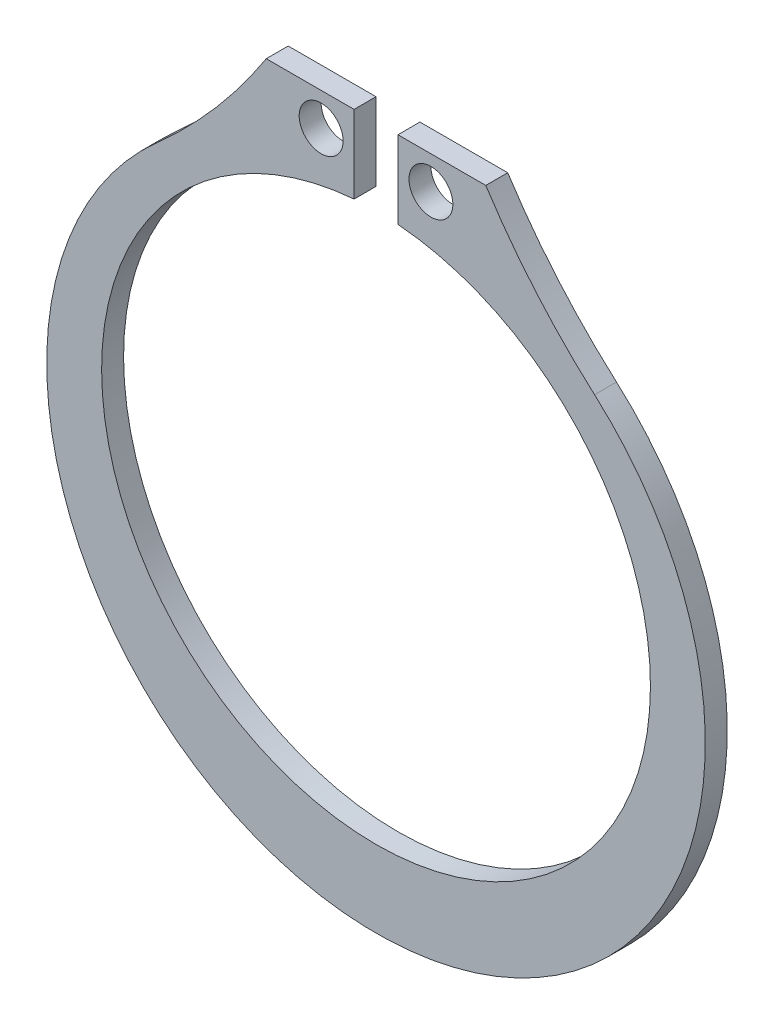
ISO-10303-21;
HEADER;
FILE_DESCRIPTION(('STEP AP214'),'2;1');
FILE_NAME('part.step','',(''),(''),'','','');
FILE_SCHEMA(('AUTOMOTIVE_DESIGN { 1 0 10303 214 1 1 1 1 }'));
ENDSEC;
DATA;
#1=APPLICATION_CONTEXT('core data for automotive mechanical design processes');
#2=APPLICATION_PROTOCOL_DEFINITION('international standard','automotive_design',2000,#1);
#3=PRODUCT_CONTEXT('',#1,'mechanical');
#4=PRODUCT('Part','Part','',(#3));
#5=PRODUCT_RELATED_PRODUCT_CATEGORY('part','',(#4));
#6=PRODUCT_DEFINITION_FORMATION('','',#4);
#7=PRODUCT_DEFINITION_CONTEXT('part definition',#1,'design');
#8=PRODUCT_DEFINITION('design','',#6,#7);
#9=PRODUCT_DEFINITION_SHAPE('','',#8);
#10=(LENGTH_UNIT() NAMED_UNIT(*) SI_UNIT(.MILLI.,.METRE.));
#11=(NAMED_UNIT(*) PLANE_ANGLE_UNIT() SI_UNIT($,.RADIAN.));
#12=(NAMED_UNIT(*) SI_UNIT($,.STERADIAN.) SOLID_ANGLE_UNIT());
#13=UNCERTAINTY_MEASURE_WITH_UNIT(LENGTH_MEASURE(1.E-05),#10,'distance_accuracy_value','');
#14=(GEOMETRIC_REPRESENTATION_CONTEXT(3) GLOBAL_UNCERTAINTY_ASSIGNED_CONTEXT((#13)) GLOBAL_UNIT_ASSIGNED_CONTEXT((#10,
#11,#12)) REPRESENTATION_CONTEXT('',''));
#15=CARTESIAN_POINT('',(0.,0.,0.));
#16=DIRECTION('',(0.,0.,1.));
#17=DIRECTION('',(1.,0.,0.));
#18=AXIS2_PLACEMENT_3D('',#15,#16,#17);
#19=CARTESIAN_POINT('',(-28.5373817339157,32.165475960613,1.));
#20=DIRECTION('',(0.,0.,-1.));
#21=DIRECTION('',(-1.,0.,0.));
#22=AXIS2_PLACEMENT_3D('',#19,#20,#21);
#23=PLANE('',#22);
#24=CARTESIAN_POINT('',(-28.5373817339157,32.165475960613,1.));
#25=DIRECTION('',(0.,0.,-1.));
#26=DIRECTION('',(-1.,0.,0.));
#27=AXIS2_PLACEMENT_3D('',#24,#25,#26);
#28=CIRCLE('',#27,28.);
#29=CARTESIAN_POINT('',(-5.,17.,1.));
#30=VERTEX_POINT('',#29);
#31=CARTESIAN_POINT('',(-9.95490060485431,11.2205148699813,1.));
#32=VERTEX_POINT('',#31);
#33=EDGE_CURVE('E146',#30,#32,#28,.T.);
#34=ORIENTED_EDGE('',*,*,#33,.T.);
#35=CARTESIAN_POINT('',(0.,0.,1.));
#36=DIRECTION('',(0.,0.,1.));
#37=DIRECTION('',(1.,0.,0.));
#38=AXIS2_PLACEMENT_3D('',#35,#36,#37);
#39=CIRCLE('',#38,15.);
#40=CARTESIAN_POINT('',(9.95490060485431,11.2205148699813,1.));
#41=VERTEX_POINT('',#40);
#42=EDGE_CURVE('E100',#32,#41,#39,.T.);
#43=ORIENTED_EDGE('',*,*,#42,.T.);
#44=CARTESIAN_POINT('',(28.5373817339157,32.165475960613,1.));
#45=DIRECTION('',(0.,0.,-1.));
#46=DIRECTION('',(1.,0.,0.));
#47=AXIS2_PLACEMENT_3D('',#44,#45,#46);
#48=CIRCLE('',#47,28.);
#49=CARTESIAN_POINT('',(5.,17.,1.));
#50=VERTEX_POINT('',#49);
#51=EDGE_CURVE('E161',#41,#50,#48,.T.);
#52=ORIENTED_EDGE('',*,*,#51,.T.);
#53=DIRECTION('',(-1.,0.,0.));
#54=VECTOR('',#53,1.);
#55=CARTESIAN_POINT('',(5.,17.,1.));
#56=LINE('',#55,#54);
#57=CARTESIAN_POINT('',(1.,17.,1.));
#58=VERTEX_POINT('',#57);
#59=EDGE_CURVE('E180',#50,#58,#56,.T.);
#60=ORIENTED_EDGE('',*,*,#59,.T.);
#61=DIRECTION('',(0.,-1.,0.));
#62=VECTOR('',#61,1.);
#63=CARTESIAN_POINT('',(1.,17.,1.));
#64=LINE('',#63,#62);
#65=CARTESIAN_POINT('',(0.999999999999999,13.4599357943771,1.));
#66=VERTEX_POINT('',#65);
#67=EDGE_CURVE('E117',#58,#66,#64,.T.);
#68=ORIENTED_EDGE('',*,*,#67,.T.);
#69=CARTESIAN_POINT('',(0.,1.,1.));
#70=DIRECTION('',(0.,0.,-1.));
#71=DIRECTION('',(1.,0.,0.));
#72=AXIS2_PLACEMENT_3D('',#69,#70,#71);
#73=CIRCLE('',#72,12.5);
#74=CARTESIAN_POINT('',(-0.999999999999999,13.4599357943771,1.));
#75=VERTEX_POINT('',#74);
#76=EDGE_CURVE('E108',#66,#75,#73,.T.);
#77=ORIENTED_EDGE('',*,*,#76,.T.);
#78=DIRECTION('',(0.,1.,0.));
#79=VECTOR('',#78,1.);
#80=CARTESIAN_POINT('',(-1.,17.,1.));
#81=LINE('',#80,#79);
#82=CARTESIAN_POINT('',(-1.,17.,1.));
#83=VERTEX_POINT('',#82);
#84=EDGE_CURVE('E114',#75,#83,#81,.T.);
#85=ORIENTED_EDGE('',*,*,#84,.T.);
#86=DIRECTION('',(-1.,0.,0.));
#87=VECTOR('',#86,1.);
#88=CARTESIAN_POINT('',(-5.,17.,1.));
#89=LINE('',#88,#87);
#90=EDGE_CURVE('E53',#83,#30,#89,.T.);
#91=ORIENTED_EDGE('',*,*,#90,.T.);
#92=EDGE_LOOP('',(#34,#43,#52,#60,#68,#77,#85,#91));
#93=FACE_BOUND('',#92,.T.);
#94=CARTESIAN_POINT('',(-2.5,15.5,1.));
#95=DIRECTION('',(0.,0.,1.));
#96=DIRECTION('',(1.,0.,0.));
#97=AXIS2_PLACEMENT_3D('',#94,#95,#96);
#98=CIRCLE('',#97,1.);
#99=CARTESIAN_POINT('',(-1.5,15.5,1.));
#100=VERTEX_POINT('',#99);
#101=EDGE_CURVE('E138',#100,#100,#98,.T.);
#102=ORIENTED_EDGE('',*,*,#101,.F.);
#103=EDGE_LOOP('',(#102));
#104=FACE_BOUND('',#103,.T.);
#105=CARTESIAN_POINT('',(2.5,15.5,1.));
#106=DIRECTION('',(0.,0.,1.));
#107=DIRECTION('',(-1.,0.,0.));
#108=AXIS2_PLACEMENT_3D('',#105,#106,#107);
#109=CIRCLE('',#108,1.);
#110=CARTESIAN_POINT('',(1.5,15.5,1.));
#111=VERTEX_POINT('',#110);
#112=EDGE_CURVE('E186',#111,#111,#109,.T.);
#113=ORIENTED_EDGE('',*,*,#112,.F.);
#114=EDGE_LOOP('',(#113));
#115=FACE_BOUND('',#114,.T.);
#116=ADVANCED_FACE('F40',(#93,#104,#115),#23,.F.);
#117=CARTESIAN_POINT('',(-28.5373817339157,32.165475960613,0.));
#118=DIRECTION('',(0.,0.,-1.));
#119=DIRECTION('',(-1.,0.,0.));
#120=AXIS2_PLACEMENT_3D('',#117,#118,#119);
#121=PLANE('',#120);
#122=CARTESIAN_POINT('',(-2.5,15.5,0.));
#123=DIRECTION('',(0.,0.,1.));
#124=DIRECTION('',(1.,0.,0.));
#125=AXIS2_PLACEMENT_3D('',#122,#123,#124);
#126=CIRCLE('',#125,1.);
#127=CARTESIAN_POINT('',(-1.5,15.5,0.));
#128=VERTEX_POINT('',#127);
#129=EDGE_CURVE('E183',#128,#128,#126,.T.);
#130=ORIENTED_EDGE('',*,*,#129,.T.);
#131=EDGE_LOOP('',(#130));
#132=FACE_BOUND('',#131,.T.);
#133=CARTESIAN_POINT('',(-28.5373817339157,32.165475960613,0.));
#134=DIRECTION('',(0.,0.,-1.));
#135=DIRECTION('',(-1.,0.,0.));
#136=AXIS2_PLACEMENT_3D('',#133,#134,#135);
#137=CIRCLE('',#136,28.);
#138=CARTESIAN_POINT('',(-5.,17.,0.));
#139=VERTEX_POINT('',#138);
#140=CARTESIAN_POINT('',(-9.95490060485431,11.2205148699813,0.));
#141=VERTEX_POINT('',#140);
#142=EDGE_CURVE('E132',#139,#141,#137,.T.);
#143=ORIENTED_EDGE('',*,*,#142,.F.);
#144=DIRECTION('',(-1.,0.,0.));
#145=VECTOR('',#144,1.);
#146=CARTESIAN_POINT('',(-5.,17.,0.));
#147=LINE('',#146,#145);
#148=CARTESIAN_POINT('',(-1.,17.,0.));
#149=VERTEX_POINT('',#148);
#150=EDGE_CURVE('E87',#149,#139,#147,.T.);
#151=ORIENTED_EDGE('',*,*,#150,.F.);
#152=DIRECTION('',(0.,1.,0.));
#153=VECTOR('',#152,1.);
#154=CARTESIAN_POINT('',(-1.,17.,0.));
#155=LINE('',#154,#153);
#156=CARTESIAN_POINT('',(-0.999999999999999,13.4599357943771,0.));
#157=VERTEX_POINT('',#156);
#158=EDGE_CURVE('E81',#157,#149,#155,.T.);
#159=ORIENTED_EDGE('',*,*,#158,.F.);
#160=CARTESIAN_POINT('',(0.,1.,0.));
#161=DIRECTION('',(0.,0.,-1.));
#162=DIRECTION('',(1.,0.,0.));
#163=AXIS2_PLACEMENT_3D('',#160,#161,#162);
#164=CIRCLE('',#163,12.5);
#165=CARTESIAN_POINT('',(0.999999999999999,13.4599357943771,0.));
#166=VERTEX_POINT('',#165);
#167=EDGE_CURVE('E125',#166,#157,#164,.T.);
#168=ORIENTED_EDGE('',*,*,#167,.F.);
#169=DIRECTION('',(0.,-1.,0.));
#170=VECTOR('',#169,1.);
#171=CARTESIAN_POINT('',(1.,17.,0.));
#172=LINE('',#171,#170);
#173=CARTESIAN_POINT('',(1.,17.,0.));
#174=VERTEX_POINT('',#173);
#175=EDGE_CURVE('E143',#174,#166,#172,.T.);
#176=ORIENTED_EDGE('',*,*,#175,.F.);
#177=DIRECTION('',(-1.,0.,0.));
#178=VECTOR('',#177,1.);
#179=CARTESIAN_POINT('',(5.,17.,0.));
#180=LINE('',#179,#178);
#181=CARTESIAN_POINT('',(5.,17.,0.));
#182=VERTEX_POINT('',#181);
#183=EDGE_CURVE('E145',#182,#174,#180,.T.);
#184=ORIENTED_EDGE('',*,*,#183,.F.);
#185=CARTESIAN_POINT('',(28.5373817339157,32.165475960613,0.));
#186=DIRECTION('',(0.,0.,-1.));
#187=DIRECTION('',(1.,0.,0.));
#188=AXIS2_PLACEMENT_3D('',#185,#186,#187);
#189=CIRCLE('',#188,28.);
#190=CARTESIAN_POINT('',(9.95490060485431,11.2205148699813,0.));
#191=VERTEX_POINT('',#190);
#192=EDGE_CURVE('E139',#191,#182,#189,.T.);
#193=ORIENTED_EDGE('',*,*,#192,.F.);
#194=CARTESIAN_POINT('',(0.,0.,0.));
#195=DIRECTION('',(0.,0.,1.));
#196=DIRECTION('',(1.,0.,0.));
#197=AXIS2_PLACEMENT_3D('',#194,#195,#196);
#198=CIRCLE('',#197,15.);
#199=EDGE_CURVE('E140',#141,#191,#198,.T.);
#200=ORIENTED_EDGE('',*,*,#199,.F.);
#201=EDGE_LOOP('',(#143,#151,#159,#168,#176,#184,#193,#200));
#202=FACE_BOUND('',#201,.T.);
#203=CARTESIAN_POINT('',(2.5,15.5,0.));
#204=DIRECTION('',(0.,0.,1.));
#205=DIRECTION('',(-1.,0.,0.));
#206=AXIS2_PLACEMENT_3D('',#203,#204,#205);
#207=CIRCLE('',#206,1.);
#208=CARTESIAN_POINT('',(1.5,15.5,0.));
#209=VERTEX_POINT('',#208);
#210=EDGE_CURVE('E188',#209,#209,#207,.T.);
#211=ORIENTED_EDGE('',*,*,#210,.T.);
#212=EDGE_LOOP('',(#211));
#213=FACE_BOUND('',#212,.T.);
#214=ADVANCED_FACE('F166',(#132,#202,#213),#121,.T.);
#215=CARTESIAN_POINT('',(-28.5373817339157,32.165475960613,1.));
#216=DIRECTION('',(0.,0.,-1.));
#217=DIRECTION('',(-1.,0.,0.));
#218=AXIS2_PLACEMENT_3D('',#215,#216,#217);
#219=CYLINDRICAL_SURFACE('',#218,28.);
#220=ORIENTED_EDGE('',*,*,#142,.T.);
#221=DIRECTION('',(0.,0.,-1.));
#222=VECTOR('',#221,1.);
#223=CARTESIAN_POINT('',(-9.95490060485431,11.2205148699813,1.));
#224=LINE('',#223,#222);
#225=EDGE_CURVE('E11',#32,#141,#224,.T.);
#226=ORIENTED_EDGE('',*,*,#225,.F.);
#227=ORIENTED_EDGE('',*,*,#33,.F.);
#228=DIRECTION('',(0.,0.,-1.));
#229=VECTOR('',#228,1.);
#230=CARTESIAN_POINT('',(-5.,17.,1.));
#231=LINE('',#230,#229);
#232=EDGE_CURVE('E127',#30,#139,#231,.T.);
#233=ORIENTED_EDGE('',*,*,#232,.T.);
#234=EDGE_LOOP('',(#220,#226,#227,#233));
#235=FACE_BOUND('',#234,.T.);
#236=ADVANCED_FACE('F39',(#235),#219,.F.);
#237=CARTESIAN_POINT('',(0.,0.,1.));
#238=DIRECTION('',(0.,0.,-1.));
#239=DIRECTION('',(-1.,0.,0.));
#240=AXIS2_PLACEMENT_3D('',#237,#238,#239);
#241=CYLINDRICAL_SURFACE('',#240,15.);
#242=ORIENTED_EDGE('',*,*,#199,.T.);
#243=DIRECTION('',(0.,0.,-1.));
#244=VECTOR('',#243,1.);
#245=CARTESIAN_POINT('',(9.95490060485431,11.2205148699813,1.));
#246=LINE('',#245,#244);
#247=EDGE_CURVE('E46',#41,#191,#246,.T.);
#248=ORIENTED_EDGE('',*,*,#247,.F.);
#249=ORIENTED_EDGE('',*,*,#42,.F.);
#250=ORIENTED_EDGE('',*,*,#225,.T.);
#251=EDGE_LOOP('',(#242,#248,#249,#250));
#252=FACE_BOUND('',#251,.T.);
#253=ADVANCED_FACE('F221',(#252),#241,.T.);
#254=CARTESIAN_POINT('',(28.5373817339157,32.165475960613,1.));
#255=DIRECTION('',(0.,0.,-1.));
#256=DIRECTION('',(-1.,0.,0.));
#257=AXIS2_PLACEMENT_3D('',#254,#255,#256);
#258=CYLINDRICAL_SURFACE('',#257,28.);
#259=ORIENTED_EDGE('',*,*,#192,.T.);
#260=DIRECTION('',(0.,0.,-1.));
#261=VECTOR('',#260,1.);
#262=CARTESIAN_POINT('',(5.,17.,1.));
#263=LINE('',#262,#261);
#264=EDGE_CURVE('E157',#50,#182,#263,.T.);
#265=ORIENTED_EDGE('',*,*,#264,.F.);
#266=ORIENTED_EDGE('',*,*,#51,.F.);
#267=ORIENTED_EDGE('',*,*,#247,.T.);
#268=EDGE_LOOP('',(#259,#265,#266,#267));
#269=FACE_BOUND('',#268,.T.);
#270=ADVANCED_FACE('F164',(#269),#258,.F.);
#271=CARTESIAN_POINT('',(5.,17.,1.));
#272=DIRECTION('',(0.,-1.,0.));
#273=DIRECTION('',(0.,0.,-1.));
#274=AXIS2_PLACEMENT_3D('',#271,#272,#273);
#275=PLANE('',#274);
#276=ORIENTED_EDGE('',*,*,#183,.T.);
#277=DIRECTION('',(0.,0.,-1.));
#278=VECTOR('',#277,1.);
#279=CARTESIAN_POINT('',(1.,17.,1.));
#280=LINE('',#279,#278);
#281=EDGE_CURVE('E155',#58,#174,#280,.T.);
#282=ORIENTED_EDGE('',*,*,#281,.F.);
#283=ORIENTED_EDGE('',*,*,#59,.F.);
#284=ORIENTED_EDGE('',*,*,#264,.T.);
#285=EDGE_LOOP('',(#276,#282,#283,#284));
#286=FACE_BOUND('',#285,.T.);
#287=ADVANCED_FACE('F171',(#286),#275,.F.);
#288=CARTESIAN_POINT('',(1.,17.,1.));
#289=DIRECTION('',(1.,0.,0.));
#290=DIRECTION('',(0.,1.,0.));
#291=AXIS2_PLACEMENT_3D('',#288,#289,#290);
#292=PLANE('',#291);
#293=ORIENTED_EDGE('',*,*,#175,.T.);
#294=DIRECTION('',(0.,0.,-1.));
#295=VECTOR('',#294,1.);
#296=CARTESIAN_POINT('',(0.999999999999999,13.4599357943771,1.));
#297=LINE('',#296,#295);
#298=EDGE_CURVE('E124',#66,#166,#297,.T.);
#299=ORIENTED_EDGE('',*,*,#298,.F.);
#300=ORIENTED_EDGE('',*,*,#67,.F.);
#301=ORIENTED_EDGE('',*,*,#281,.T.);
#302=EDGE_LOOP('',(#293,#299,#300,#301));
#303=FACE_BOUND('',#302,.T.);
#304=ADVANCED_FACE('F176',(#303),#292,.F.);
#305=CARTESIAN_POINT('',(0.,1.,1.));
#306=DIRECTION('',(0.,0.,-1.));
#307=DIRECTION('',(-1.,0.,0.));
#308=AXIS2_PLACEMENT_3D('',#305,#306,#307);
#309=CYLINDRICAL_SURFACE('',#308,12.5);
#310=ORIENTED_EDGE('',*,*,#167,.T.);
#311=DIRECTION('',(0.,0.,-1.));
#312=VECTOR('',#311,1.);
#313=CARTESIAN_POINT('',(-0.999999999999999,13.4599357943771,1.));
#314=LINE('',#313,#312);
#315=EDGE_CURVE('E123',#75,#157,#314,.T.);
#316=ORIENTED_EDGE('',*,*,#315,.F.);
#317=ORIENTED_EDGE('',*,*,#76,.F.);
#318=ORIENTED_EDGE('',*,*,#298,.T.);
#319=EDGE_LOOP('',(#310,#316,#317,#318));
#320=FACE_BOUND('',#319,.T.);
#321=ADVANCED_FACE('F122',(#320),#309,.F.);
#322=CARTESIAN_POINT('',(-1.,17.,1.));
#323=DIRECTION('',(-1.,0.,0.));
#324=DIRECTION('',(0.,-1.,0.));
#325=AXIS2_PLACEMENT_3D('',#322,#323,#324);
#326=PLANE('',#325);
#327=ORIENTED_EDGE('',*,*,#158,.T.);
#328=DIRECTION('',(0.,0.,-1.));
#329=VECTOR('',#328,1.);
#330=CARTESIAN_POINT('',(-1.,17.,1.));
#331=LINE('',#330,#329);
#332=EDGE_CURVE('E128',#83,#149,#331,.T.);
#333=ORIENTED_EDGE('',*,*,#332,.F.);
#334=ORIENTED_EDGE('',*,*,#84,.F.);
#335=ORIENTED_EDGE('',*,*,#315,.T.);
#336=EDGE_LOOP('',(#327,#333,#334,#335));
#337=FACE_BOUND('',#336,.T.);
#338=ADVANCED_FACE('F126',(#337),#326,.F.);
#339=CARTESIAN_POINT('',(-5.,17.,1.));
#340=DIRECTION('',(0.,-1.,0.));
#341=DIRECTION('',(0.,0.,-1.));
#342=AXIS2_PLACEMENT_3D('',#339,#340,#341);
#343=PLANE('',#342);
#344=ORIENTED_EDGE('',*,*,#150,.T.);
#345=ORIENTED_EDGE('',*,*,#232,.F.);
#346=ORIENTED_EDGE('',*,*,#90,.F.);
#347=ORIENTED_EDGE('',*,*,#332,.T.);
#348=EDGE_LOOP('',(#344,#345,#346,#347));
#349=FACE_BOUND('',#348,.T.);
#350=ADVANCED_FACE('F206',(#349),#343,.F.);
#351=CARTESIAN_POINT('',(-2.5,15.5,1.));
#352=DIRECTION('',(0.,0.,-1.));
#353=DIRECTION('',(-1.,0.,0.));
#354=AXIS2_PLACEMENT_3D('',#351,#352,#353);
#355=CYLINDRICAL_SURFACE('',#354,1.);
#356=ORIENTED_EDGE('',*,*,#101,.T.);
#357=EDGE_LOOP('',(#356));
#358=FACE_BOUND('',#357,.T.);
#359=ORIENTED_EDGE('',*,*,#129,.F.);
#360=EDGE_LOOP('',(#359));
#361=FACE_BOUND('',#360,.T.);
#362=ADVANCED_FACE('F207',(#358,#361),#355,.F.);
#363=CARTESIAN_POINT('',(2.5,15.5,1.));
#364=DIRECTION('',(0.,0.,-1.));
#365=DIRECTION('',(-1.,0.,0.));
#366=AXIS2_PLACEMENT_3D('',#363,#364,#365);
#367=CYLINDRICAL_SURFACE('',#366,1.);
#368=ORIENTED_EDGE('',*,*,#112,.T.);
#369=EDGE_LOOP('',(#368));
#370=FACE_BOUND('',#369,.T.);
#371=ORIENTED_EDGE('',*,*,#210,.F.);
#372=EDGE_LOOP('',(#371));
#373=FACE_BOUND('',#372,.T.);
#374=ADVANCED_FACE('F193',(#370,#373),#367,.F.);
#375=CLOSED_SHELL('',(#116,#214,#236,#253,#270,#287,#304,#321,#338,#350,#362,#374));
#376=MANIFOLD_SOLID_BREP('B2',#375);
#377=ADVANCED_BREP_SHAPE_REPRESENTATION('',(#18,#376),#14);
#378=SHAPE_DEFINITION_REPRESENTATION(#9,#377);
ENDSEC;
END-ISO-10303-21;
